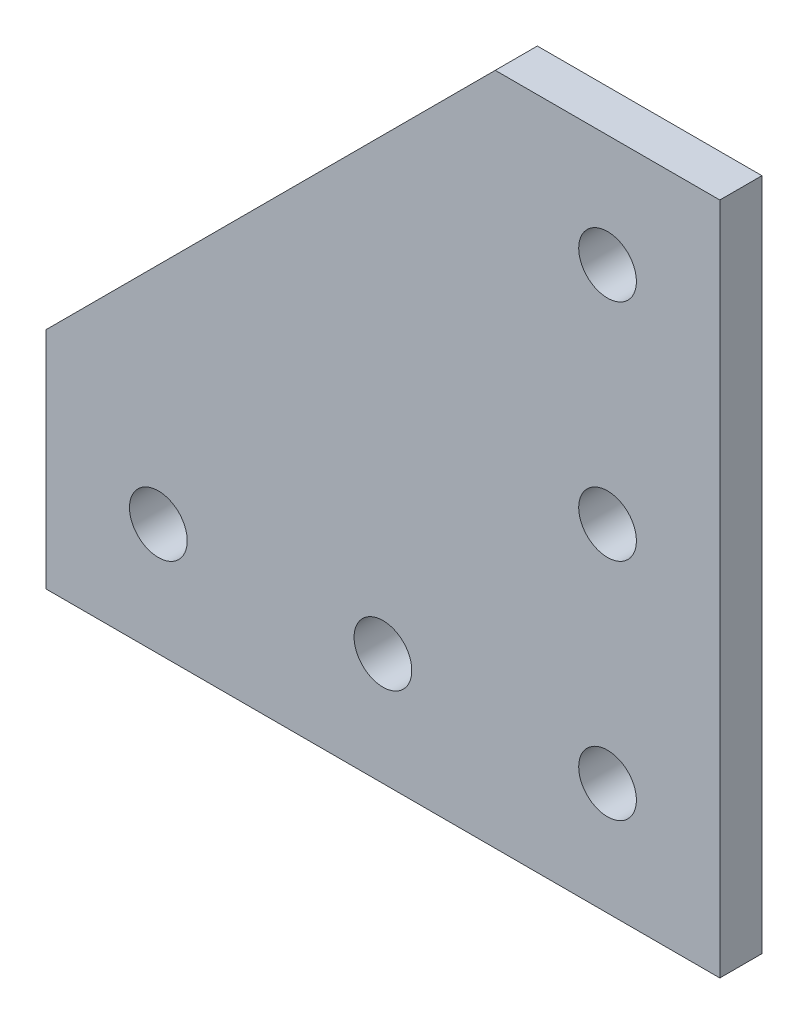
ISO-10303-21;
HEADER;
FILE_DESCRIPTION(('STEP AP214'),'2;1');
FILE_NAME('part.step','',(''),(''),'','','');
FILE_SCHEMA(('AUTOMOTIVE_DESIGN { 1 0 10303 214 1 1 1 1 }'));
ENDSEC;
DATA;
#1=APPLICATION_CONTEXT('core data for automotive mechanical design processes');
#2=APPLICATION_PROTOCOL_DEFINITION('international standard','automotive_design',2000,#1);
#3=PRODUCT_CONTEXT('',#1,'mechanical');
#4=PRODUCT('Part','Part','',(#3));
#5=PRODUCT_RELATED_PRODUCT_CATEGORY('part','',(#4));
#6=PRODUCT_DEFINITION_FORMATION('','',#4);
#7=PRODUCT_DEFINITION_CONTEXT('part definition',#1,'design');
#8=PRODUCT_DEFINITION('design','',#6,#7);
#9=PRODUCT_DEFINITION_SHAPE('','',#8);
#10=(LENGTH_UNIT() NAMED_UNIT(*) SI_UNIT(.MILLI.,.METRE.));
#11=(NAMED_UNIT(*) PLANE_ANGLE_UNIT() SI_UNIT($,.RADIAN.));
#12=(NAMED_UNIT(*) SI_UNIT($,.STERADIAN.) SOLID_ANGLE_UNIT());
#13=UNCERTAINTY_MEASURE_WITH_UNIT(LENGTH_MEASURE(1.E-05),#10,'distance_accuracy_value','');
#14=(GEOMETRIC_REPRESENTATION_CONTEXT(3) GLOBAL_UNCERTAINTY_ASSIGNED_CONTEXT((#13)) GLOBAL_UNIT_ASSIGNED_CONTEXT((#10,
#11,#12)) REPRESENTATION_CONTEXT('',''));
#15=CARTESIAN_POINT('',(0.,0.,0.));
#16=DIRECTION('',(0.,0.,1.));
#17=DIRECTION('',(1.,0.,0.));
#18=AXIS2_PLACEMENT_3D('',#15,#16,#17);
#19=CARTESIAN_POINT('',(-25.4,-25.4,-4.7625));
#20=DIRECTION('',(-0.707106781186548,0.707106781186547,0.));
#21=DIRECTION('',(-0.707106781186547,-0.707106781186548,0.));
#22=AXIS2_PLACEMENT_3D('',#19,#20,#21);
#23=PLANE('',#22);
#24=DIRECTION('',(-0.707106781186547,-0.707106781186548,0.));
#25=VECTOR('',#24,1.);
#26=CARTESIAN_POINT('',(-25.4,-25.4,0.));
#27=LINE('',#26,#25);
#28=CARTESIAN_POINT('',(25.4,25.4,0.));
#29=VERTEX_POINT('',#28);
#30=CARTESIAN_POINT('',(-25.4,-25.4,0.));
#31=VERTEX_POINT('',#30);
#32=EDGE_CURVE('E109',#29,#31,#27,.T.);
#33=ORIENTED_EDGE('',*,*,#32,.F.);
#34=DIRECTION('',(0.,0.,1.));
#35=VECTOR('',#34,1.);
#36=CARTESIAN_POINT('',(25.4,25.4,-4.7625));
#37=LINE('',#36,#35);
#38=CARTESIAN_POINT('',(25.4,25.4,-4.7625));
#39=VERTEX_POINT('',#38);
#40=EDGE_CURVE('E11',#39,#29,#37,.T.);
#41=ORIENTED_EDGE('',*,*,#40,.F.);
#42=DIRECTION('',(-0.707106781186547,-0.707106781186548,0.));
#43=VECTOR('',#42,1.);
#44=CARTESIAN_POINT('',(-25.4,-25.4,-4.7625));
#45=LINE('',#44,#43);
#46=CARTESIAN_POINT('',(-25.4,-25.4,-4.7625));
#47=VERTEX_POINT('',#46);
#48=EDGE_CURVE('E104',#39,#47,#45,.T.);
#49=ORIENTED_EDGE('',*,*,#48,.T.);
#50=DIRECTION('',(0.,0.,1.));
#51=VECTOR('',#50,1.);
#52=CARTESIAN_POINT('',(-25.4,-25.4,-4.7625));
#53=LINE('',#52,#51);
#54=EDGE_CURVE('E35',#47,#31,#53,.T.);
#55=ORIENTED_EDGE('',*,*,#54,.T.);
#56=EDGE_LOOP('',(#33,#41,#49,#55));
#57=FACE_BOUND('',#56,.T.);
#58=ADVANCED_FACE('F32',(#57),#23,.T.);
#59=CARTESIAN_POINT('',(25.4,25.4,-4.7625));
#60=DIRECTION('',(0.,1.,0.));
#61=DIRECTION('',(0.,0.,1.));
#62=AXIS2_PLACEMENT_3D('',#59,#60,#61);
#63=PLANE('',#62);
#64=DIRECTION('',(-1.,0.,0.));
#65=VECTOR('',#64,1.);
#66=CARTESIAN_POINT('',(25.4,25.4,0.));
#67=LINE('',#66,#65);
#68=CARTESIAN_POINT('',(50.8,25.4,0.));
#69=VERTEX_POINT('',#68);
#70=EDGE_CURVE('E119',#69,#29,#67,.T.);
#71=ORIENTED_EDGE('',*,*,#70,.F.);
#72=DIRECTION('',(0.,0.,1.));
#73=VECTOR('',#72,1.);
#74=CARTESIAN_POINT('',(50.8,25.4,-4.7625));
#75=LINE('',#74,#73);
#76=CARTESIAN_POINT('',(50.8,25.4,-4.7625));
#77=VERTEX_POINT('',#76);
#78=EDGE_CURVE('E41',#77,#69,#75,.T.);
#79=ORIENTED_EDGE('',*,*,#78,.F.);
#80=DIRECTION('',(-1.,0.,0.));
#81=VECTOR('',#80,1.);
#82=CARTESIAN_POINT('',(25.4,25.4,-4.7625));
#83=LINE('',#82,#81);
#84=EDGE_CURVE('E99',#77,#39,#83,.T.);
#85=ORIENTED_EDGE('',*,*,#84,.T.);
#86=ORIENTED_EDGE('',*,*,#40,.T.);
#87=EDGE_LOOP('',(#71,#79,#85,#86));
#88=FACE_BOUND('',#87,.T.);
#89=ADVANCED_FACE('F125',(#88),#63,.T.);
#90=CARTESIAN_POINT('',(50.8,25.4,-4.7625));
#91=DIRECTION('',(1.,0.,0.));
#92=DIRECTION('',(0.,1.,0.));
#93=AXIS2_PLACEMENT_3D('',#90,#91,#92);
#94=PLANE('',#93);
#95=DIRECTION('',(0.,1.,0.));
#96=VECTOR('',#95,1.);
#97=CARTESIAN_POINT('',(50.8,25.4,0.));
#98=LINE('',#97,#96);
#99=CARTESIAN_POINT('',(50.8,-50.8,0.));
#100=VERTEX_POINT('',#99);
#101=EDGE_CURVE('E88',#100,#69,#98,.T.);
#102=ORIENTED_EDGE('',*,*,#101,.F.);
#103=DIRECTION('',(0.,0.,1.));
#104=VECTOR('',#103,1.);
#105=CARTESIAN_POINT('',(50.8,-50.8,-4.7625));
#106=LINE('',#105,#104);
#107=CARTESIAN_POINT('',(50.8,-50.8,-4.7625));
#108=VERTEX_POINT('',#107);
#109=EDGE_CURVE('E83',#108,#100,#106,.T.);
#110=ORIENTED_EDGE('',*,*,#109,.F.);
#111=DIRECTION('',(0.,1.,0.));
#112=VECTOR('',#111,1.);
#113=CARTESIAN_POINT('',(50.8,25.4,-4.7625));
#114=LINE('',#113,#112);
#115=EDGE_CURVE('E86',#108,#77,#114,.T.);
#116=ORIENTED_EDGE('',*,*,#115,.T.);
#117=ORIENTED_EDGE('',*,*,#78,.T.);
#118=EDGE_LOOP('',(#102,#110,#116,#117));
#119=FACE_BOUND('',#118,.T.);
#120=ADVANCED_FACE('F85',(#119),#94,.T.);
#121=CARTESIAN_POINT('',(50.8,-50.8,-4.7625));
#122=DIRECTION('',(0.,-1.,0.));
#123=DIRECTION('',(1.,0.,0.));
#124=AXIS2_PLACEMENT_3D('',#121,#122,#123);
#125=PLANE('',#124);
#126=DIRECTION('',(1.,0.,0.));
#127=VECTOR('',#126,1.);
#128=CARTESIAN_POINT('',(50.8,-50.8,0.));
#129=LINE('',#128,#127);
#130=CARTESIAN_POINT('',(-25.4,-50.8,0.));
#131=VERTEX_POINT('',#130);
#132=EDGE_CURVE('E116',#131,#100,#129,.T.);
#133=ORIENTED_EDGE('',*,*,#132,.F.);
#134=DIRECTION('',(0.,0.,1.));
#135=VECTOR('',#134,1.);
#136=CARTESIAN_POINT('',(-25.4,-50.8,-4.7625));
#137=LINE('',#136,#135);
#138=CARTESIAN_POINT('',(-25.4,-50.8,-4.7625));
#139=VERTEX_POINT('',#138);
#140=EDGE_CURVE('E93',#139,#131,#137,.T.);
#141=ORIENTED_EDGE('',*,*,#140,.F.);
#142=DIRECTION('',(1.,0.,0.));
#143=VECTOR('',#142,1.);
#144=CARTESIAN_POINT('',(50.8,-50.8,-4.7625));
#145=LINE('',#144,#143);
#146=EDGE_CURVE('E98',#139,#108,#145,.T.);
#147=ORIENTED_EDGE('',*,*,#146,.T.);
#148=ORIENTED_EDGE('',*,*,#109,.T.);
#149=EDGE_LOOP('',(#133,#141,#147,#148));
#150=FACE_BOUND('',#149,.T.);
#151=ADVANCED_FACE('F101',(#150),#125,.T.);
#152=CARTESIAN_POINT('',(-25.4,-50.8,-4.7625));
#153=DIRECTION('',(-1.,0.,0.));
#154=DIRECTION('',(0.,0.,1.));
#155=AXIS2_PLACEMENT_3D('',#152,#153,#154);
#156=PLANE('',#155);
#157=DIRECTION('',(0.,-1.,0.));
#158=VECTOR('',#157,1.);
#159=CARTESIAN_POINT('',(-25.4,-50.8,0.));
#160=LINE('',#159,#158);
#161=EDGE_CURVE('E112',#31,#131,#160,.T.);
#162=ORIENTED_EDGE('',*,*,#161,.F.);
#163=ORIENTED_EDGE('',*,*,#54,.F.);
#164=DIRECTION('',(0.,-1.,0.));
#165=VECTOR('',#164,1.);
#166=CARTESIAN_POINT('',(-25.4,-50.8,-4.7625));
#167=LINE('',#166,#165);
#168=EDGE_CURVE('E102',#47,#139,#167,.T.);
#169=ORIENTED_EDGE('',*,*,#168,.T.);
#170=ORIENTED_EDGE('',*,*,#140,.T.);
#171=EDGE_LOOP('',(#162,#163,#169,#170));
#172=FACE_BOUND('',#171,.T.);
#173=ADVANCED_FACE('F122',(#172),#156,.T.);
#174=CARTESIAN_POINT('',(25.4,25.4,-4.7625));
#175=DIRECTION('',(0.,0.,-1.));
#176=DIRECTION('',(-1.,0.,0.));
#177=AXIS2_PLACEMENT_3D('',#174,#175,#176);
#178=PLANE('',#177);
#179=CARTESIAN_POINT('',(38.1,12.7,-4.7625));
#180=DIRECTION('',(0.,0.,-1.));
#181=DIRECTION('',(-1.,0.,0.));
#182=AXIS2_PLACEMENT_3D('',#179,#180,#181);
#183=CIRCLE('',#182,3.2639);
#184=CARTESIAN_POINT('',(34.8361,12.7,-4.7625));
#185=VERTEX_POINT('',#184);
#186=EDGE_CURVE('E175',#185,#185,#183,.T.);
#187=ORIENTED_EDGE('',*,*,#186,.F.);
#188=EDGE_LOOP('',(#187));
#189=FACE_BOUND('',#188,.T.);
#190=CARTESIAN_POINT('',(38.1,-12.7,-4.7625));
#191=DIRECTION('',(0.,0.,-1.));
#192=DIRECTION('',(-1.,0.,0.));
#193=AXIS2_PLACEMENT_3D('',#190,#191,#192);
#194=CIRCLE('',#193,3.2639);
#195=CARTESIAN_POINT('',(34.8361,-12.7,-4.7625));
#196=VERTEX_POINT('',#195);
#197=EDGE_CURVE('E177',#196,#196,#194,.T.);
#198=ORIENTED_EDGE('',*,*,#197,.F.);
#199=EDGE_LOOP('',(#198));
#200=FACE_BOUND('',#199,.T.);
#201=CARTESIAN_POINT('',(-12.7,-38.1,-4.7625));
#202=DIRECTION('',(0.,0.,-1.));
#203=DIRECTION('',(-1.,0.,0.));
#204=AXIS2_PLACEMENT_3D('',#201,#202,#203);
#205=CIRCLE('',#204,3.2639);
#206=CARTESIAN_POINT('',(-15.9639,-38.1,-4.7625));
#207=VERTEX_POINT('',#206);
#208=EDGE_CURVE('E183',#207,#207,#205,.T.);
#209=ORIENTED_EDGE('',*,*,#208,.F.);
#210=EDGE_LOOP('',(#209));
#211=FACE_BOUND('',#210,.T.);
#212=CARTESIAN_POINT('',(12.7,-38.1,-4.7625));
#213=DIRECTION('',(0.,0.,-1.));
#214=DIRECTION('',(-1.,0.,0.));
#215=AXIS2_PLACEMENT_3D('',#212,#213,#214);
#216=CIRCLE('',#215,3.2639);
#217=CARTESIAN_POINT('',(9.43609999999995,-38.1,-4.7625));
#218=VERTEX_POINT('',#217);
#219=EDGE_CURVE('E189',#218,#218,#216,.T.);
#220=ORIENTED_EDGE('',*,*,#219,.F.);
#221=EDGE_LOOP('',(#220));
#222=FACE_BOUND('',#221,.T.);
#223=CARTESIAN_POINT('',(38.1,-38.1,-4.7625));
#224=DIRECTION('',(0.,0.,-1.));
#225=DIRECTION('',(-1.,0.,0.));
#226=AXIS2_PLACEMENT_3D('',#223,#224,#225);
#227=CIRCLE('',#226,3.2639);
#228=CARTESIAN_POINT('',(34.8361,-38.1,-4.7625));
#229=VERTEX_POINT('',#228);
#230=EDGE_CURVE('E195',#229,#229,#227,.T.);
#231=ORIENTED_EDGE('',*,*,#230,.F.);
#232=EDGE_LOOP('',(#231));
#233=FACE_BOUND('',#232,.T.);
#234=ORIENTED_EDGE('',*,*,#48,.F.);
#235=ORIENTED_EDGE('',*,*,#84,.F.);
#236=ORIENTED_EDGE('',*,*,#115,.F.);
#237=ORIENTED_EDGE('',*,*,#146,.F.);
#238=ORIENTED_EDGE('',*,*,#168,.F.);
#239=EDGE_LOOP('',(#234,#235,#236,#237,#238));
#240=FACE_BOUND('',#239,.T.);
#241=ADVANCED_FACE('F97',(#189,#200,#211,#222,#233,#240),#178,.T.);
#242=CARTESIAN_POINT('',(25.4,25.4,0.));
#243=DIRECTION('',(0.,0.,-1.));
#244=DIRECTION('',(-1.,0.,0.));
#245=AXIS2_PLACEMENT_3D('',#242,#243,#244);
#246=PLANE('',#245);
#247=CARTESIAN_POINT('',(38.1,12.7,0.));
#248=DIRECTION('',(0.,0.,-1.));
#249=DIRECTION('',(-1.,0.,0.));
#250=AXIS2_PLACEMENT_3D('',#247,#248,#249);
#251=CIRCLE('',#250,3.2639);
#252=CARTESIAN_POINT('',(34.8361,12.7,0.));
#253=VERTEX_POINT('',#252);
#254=EDGE_CURVE('E173',#253,#253,#251,.T.);
#255=ORIENTED_EDGE('',*,*,#254,.T.);
#256=EDGE_LOOP('',(#255));
#257=FACE_BOUND('',#256,.T.);
#258=CARTESIAN_POINT('',(38.1,-12.7,0.));
#259=DIRECTION('',(0.,0.,-1.));
#260=DIRECTION('',(-1.,0.,0.));
#261=AXIS2_PLACEMENT_3D('',#258,#259,#260);
#262=CIRCLE('',#261,3.2639);
#263=CARTESIAN_POINT('',(34.8361,-12.7,0.));
#264=VERTEX_POINT('',#263);
#265=EDGE_CURVE('E180',#264,#264,#262,.T.);
#266=ORIENTED_EDGE('',*,*,#265,.T.);
#267=EDGE_LOOP('',(#266));
#268=FACE_BOUND('',#267,.T.);
#269=CARTESIAN_POINT('',(-12.7,-38.1,0.));
#270=DIRECTION('',(0.,0.,-1.));
#271=DIRECTION('',(-1.,0.,0.));
#272=AXIS2_PLACEMENT_3D('',#269,#270,#271);
#273=CIRCLE('',#272,3.2639);
#274=CARTESIAN_POINT('',(-15.9639,-38.1,0.));
#275=VERTEX_POINT('',#274);
#276=EDGE_CURVE('E186',#275,#275,#273,.T.);
#277=ORIENTED_EDGE('',*,*,#276,.T.);
#278=EDGE_LOOP('',(#277));
#279=FACE_BOUND('',#278,.T.);
#280=CARTESIAN_POINT('',(12.7,-38.1,0.));
#281=DIRECTION('',(0.,0.,-1.));
#282=DIRECTION('',(-1.,0.,0.));
#283=AXIS2_PLACEMENT_3D('',#280,#281,#282);
#284=CIRCLE('',#283,3.2639);
#285=CARTESIAN_POINT('',(9.43609999999995,-38.1,0.));
#286=VERTEX_POINT('',#285);
#287=EDGE_CURVE('E192',#286,#286,#284,.T.);
#288=ORIENTED_EDGE('',*,*,#287,.T.);
#289=EDGE_LOOP('',(#288));
#290=FACE_BOUND('',#289,.T.);
#291=CARTESIAN_POINT('',(38.1,-38.1,0.));
#292=DIRECTION('',(0.,0.,-1.));
#293=DIRECTION('',(-1.,0.,0.));
#294=AXIS2_PLACEMENT_3D('',#291,#292,#293);
#295=CIRCLE('',#294,3.2639);
#296=CARTESIAN_POINT('',(34.8361,-38.1,0.));
#297=VERTEX_POINT('',#296);
#298=EDGE_CURVE('E113',#297,#297,#295,.T.);
#299=ORIENTED_EDGE('',*,*,#298,.T.);
#300=EDGE_LOOP('',(#299));
#301=FACE_BOUND('',#300,.T.);
#302=ORIENTED_EDGE('',*,*,#32,.T.);
#303=ORIENTED_EDGE('',*,*,#161,.T.);
#304=ORIENTED_EDGE('',*,*,#132,.T.);
#305=ORIENTED_EDGE('',*,*,#101,.T.);
#306=ORIENTED_EDGE('',*,*,#70,.T.);
#307=EDGE_LOOP('',(#302,#303,#304,#305,#306));
#308=FACE_BOUND('',#307,.T.);
#309=ADVANCED_FACE('F124',(#257,#268,#279,#290,#301,#308),#246,.F.);
#310=CARTESIAN_POINT('',(38.1,-38.1,0.));
#311=DIRECTION('',(0.,0.,-1.));
#312=DIRECTION('',(-1.,0.,0.));
#313=AXIS2_PLACEMENT_3D('',#310,#311,#312);
#314=CYLINDRICAL_SURFACE('',#313,3.2639);
#315=CARTESIAN_POINT('',(34.8361,-38.1,0.));
#316=CARTESIAN_POINT('',(34.8361,-38.1,-0.049609375));
#317=CARTESIAN_POINT('',(34.8361,-38.1,-0.09921875));
#318=CARTESIAN_POINT('',(34.8361,-38.1,-0.1984375));
#319=CARTESIAN_POINT('',(34.8361,-38.1,-0.248046875));
#320=CARTESIAN_POINT('',(34.8361,-38.1,-0.347265625));
#321=CARTESIAN_POINT('',(34.8361,-38.1,-0.396875));
#322=CARTESIAN_POINT('',(34.8361,-38.1,-0.49609375));
#323=CARTESIAN_POINT('',(34.8361,-38.1,-0.545703125));
#324=CARTESIAN_POINT('',(34.8361,-38.1,-0.644921875));
#325=CARTESIAN_POINT('',(34.8361,-38.1,-0.69453125));
#326=CARTESIAN_POINT('',(34.8361,-38.1,-0.79375));
#327=CARTESIAN_POINT('',(34.8361,-38.1,-0.843359375));
#328=CARTESIAN_POINT('',(34.8361,-38.1,-0.942578125));
#329=CARTESIAN_POINT('',(34.8361,-38.1,-0.9921875));
#330=CARTESIAN_POINT('',(34.8361,-38.1,-1.09140625));
#331=CARTESIAN_POINT('',(34.8361,-38.1,-1.141015625));
#332=CARTESIAN_POINT('',(34.8361,-38.1,-1.240234375));
#333=CARTESIAN_POINT('',(34.8361,-38.1,-1.28984375));
#334=CARTESIAN_POINT('',(34.8361,-38.1,-1.3890625));
#335=CARTESIAN_POINT('',(34.8361,-38.1,-1.438671875));
#336=CARTESIAN_POINT('',(34.8361,-38.1,-1.537890625));
#337=CARTESIAN_POINT('',(34.8361,-38.1,-1.5875));
#338=CARTESIAN_POINT('',(34.8361,-38.1,-1.68671875));
#339=CARTESIAN_POINT('',(34.8361,-38.1,-1.736328125));
#340=CARTESIAN_POINT('',(34.8361,-38.1,-1.835546875));
#341=CARTESIAN_POINT('',(34.8361,-38.1,-1.88515625));
#342=CARTESIAN_POINT('',(34.8361,-38.1,-1.984375));
#343=CARTESIAN_POINT('',(34.8361,-38.1,-2.033984375));
#344=CARTESIAN_POINT('',(34.8361,-38.1,-2.133203125));
#345=CARTESIAN_POINT('',(34.8361,-38.1,-2.1828125));
#346=CARTESIAN_POINT('',(34.8361,-38.1,-2.28203125));
#347=CARTESIAN_POINT('',(34.8361,-38.1,-2.331640625));
#348=CARTESIAN_POINT('',(34.8361,-38.1,-2.430859375));
#349=CARTESIAN_POINT('',(34.8361,-38.1,-2.48046875));
#350=CARTESIAN_POINT('',(34.8361,-38.1,-2.5796875));
#351=CARTESIAN_POINT('',(34.8361,-38.1,-2.629296875));
#352=CARTESIAN_POINT('',(34.8361,-38.1,-2.728515625));
#353=CARTESIAN_POINT('',(34.8361,-38.1,-2.778125));
#354=CARTESIAN_POINT('',(34.8361,-38.1,-2.87734375));
#355=CARTESIAN_POINT('',(34.8361,-38.1,-2.926953125));
#356=CARTESIAN_POINT('',(34.8361,-38.1,-3.026171875));
#357=CARTESIAN_POINT('',(34.8361,-38.1,-3.07578125));
#358=CARTESIAN_POINT('',(34.8361,-38.1,-3.175));
#359=CARTESIAN_POINT('',(34.8361,-38.1,-3.224609375));
#360=CARTESIAN_POINT('',(34.8361,-38.1,-3.323828125));
#361=CARTESIAN_POINT('',(34.8361,-38.1,-3.3734375));
#362=CARTESIAN_POINT('',(34.8361,-38.1,-3.47265625));
#363=CARTESIAN_POINT('',(34.8361,-38.1,-3.522265625));
#364=CARTESIAN_POINT('',(34.8361,-38.1,-3.621484375));
#365=CARTESIAN_POINT('',(34.8361,-38.1,-3.67109375));
#366=CARTESIAN_POINT('',(34.8361,-38.1,-3.7703125));
#367=CARTESIAN_POINT('',(34.8361,-38.1,-3.819921875));
#368=CARTESIAN_POINT('',(34.8361,-38.1,-3.919140625));
#369=CARTESIAN_POINT('',(34.8361,-38.1,-3.96875));
#370=CARTESIAN_POINT('',(34.8361,-38.1,-4.06796875));
#371=CARTESIAN_POINT('',(34.8361,-38.1,-4.117578125));
#372=CARTESIAN_POINT('',(34.8361,-38.1,-4.216796875));
#373=CARTESIAN_POINT('',(34.8361,-38.1,-4.26640625));
#374=CARTESIAN_POINT('',(34.8361,-38.1,-4.365625));
#375=CARTESIAN_POINT('',(34.8361,-38.1,-4.415234375));
#376=CARTESIAN_POINT('',(34.8361,-38.1,-4.514453125));
#377=CARTESIAN_POINT('',(34.8361,-38.1,-4.5640625));
#378=CARTESIAN_POINT('',(34.8361,-38.1,-4.66328125));
#379=CARTESIAN_POINT('',(34.8361,-38.1,-4.712890625));
#380=CARTESIAN_POINT('',(34.8361,-38.1,-4.7625));
#381=B_SPLINE_CURVE_WITH_KNOTS('',3,(#315,#316,#317,#318,#319,#320,#321,#322,#323,#324,#325,
#326,#327,#328,#329,#330,#331,#332,#333,#334,#335,#336,#337,#338,#339,#340,#341,#342,#343,#344,
#345,#346,#347,#348,#349,#350,#351,#352,#353,#354,#355,#356,#357,#358,#359,#360,#361,#362,#363,
#364,#365,#366,#367,#368,#369,#370,#371,#372,#373,#374,#375,#376,#377,#378,#379,#380),
.UNSPECIFIED.,.F.,.F.,(4,2,2,2,2,2,2,2,2,2,2,2,2,2,2,2,2,2,2,2,2,2,2,2,2,2,2,2,2,2,2,2,4),(0.,
0.148828125,0.29765625,0.446484375,0.5953125,0.744140625,0.89296875,1.041796875,1.190625,
1.339453125,1.48828125,1.637109375,1.7859375,1.934765625,2.08359375,2.232421875,2.38125,
2.530078125,2.67890625,2.827734375,2.9765625,3.125390625,3.27421875,3.423046875,3.571875,
3.720703125,3.86953125,4.018359375,4.1671875,4.316015625,4.46484375,4.613671875,4.7625),.UNSPECIFIED.);
#382=EDGE_CURVE('BSEAM145',#297,#229,#381,.T.);
#383=ORIENTED_EDGE('',*,*,#298,.F.);
#384=ORIENTED_EDGE('',*,*,#230,.T.);
#385=ORIENTED_EDGE('',*,*,#382,.T.);
#386=ORIENTED_EDGE('',*,*,#382,.F.);
#387=EDGE_LOOP('',(#383,#385,#384,#386));
#388=FACE_BOUND('',#387,.T.);
#389=ADVANCED_FACE('F145',(#388),#314,.F.);
#390=CARTESIAN_POINT('',(12.7,-38.1,0.));
#391=DIRECTION('',(0.,0.,-1.));
#392=DIRECTION('',(-1.,0.,0.));
#393=AXIS2_PLACEMENT_3D('',#390,#391,#392);
#394=CYLINDRICAL_SURFACE('',#393,3.2639);
#395=CARTESIAN_POINT('',(9.43609999999995,-38.1,0.));
#396=CARTESIAN_POINT('',(9.43609999999995,-38.1,-0.049609375));
#397=CARTESIAN_POINT('',(9.43609999999995,-38.1,-0.09921875));
#398=CARTESIAN_POINT('',(9.43609999999995,-38.1,-0.1984375));
#399=CARTESIAN_POINT('',(9.43609999999995,-38.1,-0.248046875));
#400=CARTESIAN_POINT('',(9.43609999999995,-38.1,-0.347265625));
#401=CARTESIAN_POINT('',(9.43609999999995,-38.1,-0.396875));
#402=CARTESIAN_POINT('',(9.43609999999995,-38.1,-0.49609375));
#403=CARTESIAN_POINT('',(9.43609999999995,-38.1,-0.545703125));
#404=CARTESIAN_POINT('',(9.43609999999995,-38.1,-0.644921875));
#405=CARTESIAN_POINT('',(9.43609999999995,-38.1,-0.69453125));
#406=CARTESIAN_POINT('',(9.43609999999995,-38.1,-0.79375));
#407=CARTESIAN_POINT('',(9.43609999999995,-38.1,-0.843359375));
#408=CARTESIAN_POINT('',(9.43609999999995,-38.1,-0.942578125));
#409=CARTESIAN_POINT('',(9.43609999999995,-38.1,-0.9921875));
#410=CARTESIAN_POINT('',(9.43609999999995,-38.1,-1.09140625));
#411=CARTESIAN_POINT('',(9.43609999999995,-38.1,-1.141015625));
#412=CARTESIAN_POINT('',(9.43609999999995,-38.1,-1.240234375));
#413=CARTESIAN_POINT('',(9.43609999999995,-38.1,-1.28984375));
#414=CARTESIAN_POINT('',(9.43609999999995,-38.1,-1.3890625));
#415=CARTESIAN_POINT('',(9.43609999999995,-38.1,-1.438671875));
#416=CARTESIAN_POINT('',(9.43609999999995,-38.1,-1.537890625));
#417=CARTESIAN_POINT('',(9.43609999999995,-38.1,-1.5875));
#418=CARTESIAN_POINT('',(9.43609999999995,-38.1,-1.68671875));
#419=CARTESIAN_POINT('',(9.43609999999995,-38.1,-1.736328125));
#420=CARTESIAN_POINT('',(9.43609999999995,-38.1,-1.835546875));
#421=CARTESIAN_POINT('',(9.43609999999995,-38.1,-1.88515625));
#422=CARTESIAN_POINT('',(9.43609999999995,-38.1,-1.984375));
#423=CARTESIAN_POINT('',(9.43609999999995,-38.1,-2.033984375));
#424=CARTESIAN_POINT('',(9.43609999999995,-38.1,-2.133203125));
#425=CARTESIAN_POINT('',(9.43609999999995,-38.1,-2.1828125));
#426=CARTESIAN_POINT('',(9.43609999999995,-38.1,-2.28203125));
#427=CARTESIAN_POINT('',(9.43609999999995,-38.1,-2.331640625));
#428=CARTESIAN_POINT('',(9.43609999999995,-38.1,-2.430859375));
#429=CARTESIAN_POINT('',(9.43609999999995,-38.1,-2.48046875));
#430=CARTESIAN_POINT('',(9.43609999999995,-38.1,-2.5796875));
#431=CARTESIAN_POINT('',(9.43609999999995,-38.1,-2.629296875));
#432=CARTESIAN_POINT('',(9.43609999999995,-38.1,-2.728515625));
#433=CARTESIAN_POINT('',(9.43609999999995,-38.1,-2.778125));
#434=CARTESIAN_POINT('',(9.43609999999995,-38.1,-2.87734375));
#435=CARTESIAN_POINT('',(9.43609999999995,-38.1,-2.926953125));
#436=CARTESIAN_POINT('',(9.43609999999995,-38.1,-3.026171875));
#437=CARTESIAN_POINT('',(9.43609999999995,-38.1,-3.07578125));
#438=CARTESIAN_POINT('',(9.43609999999995,-38.1,-3.175));
#439=CARTESIAN_POINT('',(9.43609999999995,-38.1,-3.224609375));
#440=CARTESIAN_POINT('',(9.43609999999995,-38.1,-3.323828125));
#441=CARTESIAN_POINT('',(9.43609999999995,-38.1,-3.3734375));
#442=CARTESIAN_POINT('',(9.43609999999995,-38.1,-3.47265625));
#443=CARTESIAN_POINT('',(9.43609999999995,-38.1,-3.522265625));
#444=CARTESIAN_POINT('',(9.43609999999995,-38.1,-3.621484375));
#445=CARTESIAN_POINT('',(9.43609999999995,-38.1,-3.67109375));
#446=CARTESIAN_POINT('',(9.43609999999995,-38.1,-3.7703125));
#447=CARTESIAN_POINT('',(9.43609999999995,-38.1,-3.819921875));
#448=CARTESIAN_POINT('',(9.43609999999995,-38.1,-3.919140625));
#449=CARTESIAN_POINT('',(9.43609999999995,-38.1,-3.96875));
#450=CARTESIAN_POINT('',(9.43609999999995,-38.1,-4.06796875));
#451=CARTESIAN_POINT('',(9.43609999999995,-38.1,-4.117578125));
#452=CARTESIAN_POINT('',(9.43609999999995,-38.1,-4.216796875));
#453=CARTESIAN_POINT('',(9.43609999999995,-38.1,-4.26640625));
#454=CARTESIAN_POINT('',(9.43609999999995,-38.1,-4.365625));
#455=CARTESIAN_POINT('',(9.43609999999995,-38.1,-4.415234375));
#456=CARTESIAN_POINT('',(9.43609999999995,-38.1,-4.514453125));
#457=CARTESIAN_POINT('',(9.43609999999995,-38.1,-4.5640625));
#458=CARTESIAN_POINT('',(9.43609999999995,-38.1,-4.66328125));
#459=CARTESIAN_POINT('',(9.43609999999995,-38.1,-4.712890625));
#460=CARTESIAN_POINT('',(9.43609999999995,-38.1,-4.7625));
#461=B_SPLINE_CURVE_WITH_KNOTS('',3,(#395,#396,#397,#398,#399,#400,#401,#402,#403,#404,#405,
#406,#407,#408,#409,#410,#411,#412,#413,#414,#415,#416,#417,#418,#419,#420,#421,#422,#423,#424,
#425,#426,#427,#428,#429,#430,#431,#432,#433,#434,#435,#436,#437,#438,#439,#440,#441,#442,#443,
#444,#445,#446,#447,#448,#449,#450,#451,#452,#453,#454,#455,#456,#457,#458,#459,#460),
.UNSPECIFIED.,.F.,.F.,(4,2,2,2,2,2,2,2,2,2,2,2,2,2,2,2,2,2,2,2,2,2,2,2,2,2,2,2,2,2,2,2,4),(0.,
0.148828125,0.29765625,0.446484375,0.5953125,0.744140625,0.89296875,1.041796875,1.190625,
1.339453125,1.48828125,1.637109375,1.7859375,1.934765625,2.08359375,2.232421875,2.38125,
2.530078125,2.67890625,2.827734375,2.9765625,3.125390625,3.27421875,3.423046875,3.571875,
3.720703125,3.86953125,4.018359375,4.1671875,4.316015625,4.46484375,4.613671875,4.7625),.UNSPECIFIED.);
#462=EDGE_CURVE('BSEAM152',#286,#218,#461,.T.);
#463=ORIENTED_EDGE('',*,*,#287,.F.);
#464=ORIENTED_EDGE('',*,*,#219,.T.);
#465=ORIENTED_EDGE('',*,*,#462,.T.);
#466=ORIENTED_EDGE('',*,*,#462,.F.);
#467=EDGE_LOOP('',(#463,#465,#464,#466));
#468=FACE_BOUND('',#467,.T.);
#469=ADVANCED_FACE('F152',(#468),#394,.F.);
#470=CARTESIAN_POINT('',(-12.7,-38.1,0.));
#471=DIRECTION('',(0.,0.,-1.));
#472=DIRECTION('',(-1.,0.,0.));
#473=AXIS2_PLACEMENT_3D('',#470,#471,#472);
#474=CYLINDRICAL_SURFACE('',#473,3.2639);
#475=CARTESIAN_POINT('',(-15.9639,-38.1,0.));
#476=CARTESIAN_POINT('',(-15.9639,-38.1,-0.049609375));
#477=CARTESIAN_POINT('',(-15.9639,-38.1,-0.09921875));
#478=CARTESIAN_POINT('',(-15.9639,-38.1,-0.1984375));
#479=CARTESIAN_POINT('',(-15.9639,-38.1,-0.248046875));
#480=CARTESIAN_POINT('',(-15.9639,-38.1,-0.347265625));
#481=CARTESIAN_POINT('',(-15.9639,-38.1,-0.396875));
#482=CARTESIAN_POINT('',(-15.9639,-38.1,-0.49609375));
#483=CARTESIAN_POINT('',(-15.9639,-38.1,-0.545703125));
#484=CARTESIAN_POINT('',(-15.9639,-38.1,-0.644921875));
#485=CARTESIAN_POINT('',(-15.9639,-38.1,-0.69453125));
#486=CARTESIAN_POINT('',(-15.9639,-38.1,-0.79375));
#487=CARTESIAN_POINT('',(-15.9639,-38.1,-0.843359375));
#488=CARTESIAN_POINT('',(-15.9639,-38.1,-0.942578125));
#489=CARTESIAN_POINT('',(-15.9639,-38.1,-0.9921875));
#490=CARTESIAN_POINT('',(-15.9639,-38.1,-1.09140625));
#491=CARTESIAN_POINT('',(-15.9639,-38.1,-1.141015625));
#492=CARTESIAN_POINT('',(-15.9639,-38.1,-1.240234375));
#493=CARTESIAN_POINT('',(-15.9639,-38.1,-1.28984375));
#494=CARTESIAN_POINT('',(-15.9639,-38.1,-1.3890625));
#495=CARTESIAN_POINT('',(-15.9639,-38.1,-1.438671875));
#496=CARTESIAN_POINT('',(-15.9639,-38.1,-1.537890625));
#497=CARTESIAN_POINT('',(-15.9639,-38.1,-1.5875));
#498=CARTESIAN_POINT('',(-15.9639,-38.1,-1.68671875));
#499=CARTESIAN_POINT('',(-15.9639,-38.1,-1.736328125));
#500=CARTESIAN_POINT('',(-15.9639,-38.1,-1.835546875));
#501=CARTESIAN_POINT('',(-15.9639,-38.1,-1.88515625));
#502=CARTESIAN_POINT('',(-15.9639,-38.1,-1.984375));
#503=CARTESIAN_POINT('',(-15.9639,-38.1,-2.033984375));
#504=CARTESIAN_POINT('',(-15.9639,-38.1,-2.133203125));
#505=CARTESIAN_POINT('',(-15.9639,-38.1,-2.1828125));
#506=CARTESIAN_POINT('',(-15.9639,-38.1,-2.28203125));
#507=CARTESIAN_POINT('',(-15.9639,-38.1,-2.331640625));
#508=CARTESIAN_POINT('',(-15.9639,-38.1,-2.430859375));
#509=CARTESIAN_POINT('',(-15.9639,-38.1,-2.48046875));
#510=CARTESIAN_POINT('',(-15.9639,-38.1,-2.5796875));
#511=CARTESIAN_POINT('',(-15.9639,-38.1,-2.629296875));
#512=CARTESIAN_POINT('',(-15.9639,-38.1,-2.728515625));
#513=CARTESIAN_POINT('',(-15.9639,-38.1,-2.778125));
#514=CARTESIAN_POINT('',(-15.9639,-38.1,-2.87734375));
#515=CARTESIAN_POINT('',(-15.9639,-38.1,-2.926953125));
#516=CARTESIAN_POINT('',(-15.9639,-38.1,-3.026171875));
#517=CARTESIAN_POINT('',(-15.9639,-38.1,-3.07578125));
#518=CARTESIAN_POINT('',(-15.9639,-38.1,-3.175));
#519=CARTESIAN_POINT('',(-15.9639,-38.1,-3.224609375));
#520=CARTESIAN_POINT('',(-15.9639,-38.1,-3.323828125));
#521=CARTESIAN_POINT('',(-15.9639,-38.1,-3.3734375));
#522=CARTESIAN_POINT('',(-15.9639,-38.1,-3.47265625));
#523=CARTESIAN_POINT('',(-15.9639,-38.1,-3.522265625));
#524=CARTESIAN_POINT('',(-15.9639,-38.1,-3.621484375));
#525=CARTESIAN_POINT('',(-15.9639,-38.1,-3.67109375));
#526=CARTESIAN_POINT('',(-15.9639,-38.1,-3.7703125));
#527=CARTESIAN_POINT('',(-15.9639,-38.1,-3.819921875));
#528=CARTESIAN_POINT('',(-15.9639,-38.1,-3.919140625));
#529=CARTESIAN_POINT('',(-15.9639,-38.1,-3.96875));
#530=CARTESIAN_POINT('',(-15.9639,-38.1,-4.06796875));
#531=CARTESIAN_POINT('',(-15.9639,-38.1,-4.117578125));
#532=CARTESIAN_POINT('',(-15.9639,-38.1,-4.216796875));
#533=CARTESIAN_POINT('',(-15.9639,-38.1,-4.26640625));
#534=CARTESIAN_POINT('',(-15.9639,-38.1,-4.365625));
#535=CARTESIAN_POINT('',(-15.9639,-38.1,-4.415234375));
#536=CARTESIAN_POINT('',(-15.9639,-38.1,-4.514453125));
#537=CARTESIAN_POINT('',(-15.9639,-38.1,-4.5640625));
#538=CARTESIAN_POINT('',(-15.9639,-38.1,-4.66328125));
#539=CARTESIAN_POINT('',(-15.9639,-38.1,-4.712890625));
#540=CARTESIAN_POINT('',(-15.9639,-38.1,-4.7625));
#541=B_SPLINE_CURVE_WITH_KNOTS('',3,(#475,#476,#477,#478,#479,#480,#481,#482,#483,#484,#485,
#486,#487,#488,#489,#490,#491,#492,#493,#494,#495,#496,#497,#498,#499,#500,#501,#502,#503,#504,
#505,#506,#507,#508,#509,#510,#511,#512,#513,#514,#515,#516,#517,#518,#519,#520,#521,#522,#523,
#524,#525,#526,#527,#528,#529,#530,#531,#532,#533,#534,#535,#536,#537,#538,#539,#540),
.UNSPECIFIED.,.F.,.F.,(4,2,2,2,2,2,2,2,2,2,2,2,2,2,2,2,2,2,2,2,2,2,2,2,2,2,2,2,2,2,2,2,4),(0.,
0.148828125,0.29765625,0.446484375,0.5953125,0.744140625,0.89296875,1.041796875,1.190625,
1.339453125,1.48828125,1.637109375,1.7859375,1.934765625,2.08359375,2.232421875,2.38125,
2.530078125,2.67890625,2.827734375,2.9765625,3.125390625,3.27421875,3.423046875,3.571875,
3.720703125,3.86953125,4.018359375,4.1671875,4.316015625,4.46484375,4.613671875,4.7625),.UNSPECIFIED.);
#542=EDGE_CURVE('BSEAM156',#275,#207,#541,.T.);
#543=ORIENTED_EDGE('',*,*,#276,.F.);
#544=ORIENTED_EDGE('',*,*,#208,.T.);
#545=ORIENTED_EDGE('',*,*,#542,.T.);
#546=ORIENTED_EDGE('',*,*,#542,.F.);
#547=EDGE_LOOP('',(#543,#545,#544,#546));
#548=FACE_BOUND('',#547,.T.);
#549=ADVANCED_FACE('F156',(#548),#474,.F.);
#550=CARTESIAN_POINT('',(38.1,-12.7,0.));
#551=DIRECTION('',(0.,0.,-1.));
#552=DIRECTION('',(-1.,0.,0.));
#553=AXIS2_PLACEMENT_3D('',#550,#551,#552);
#554=CYLINDRICAL_SURFACE('',#553,3.2639);
#555=CARTESIAN_POINT('',(34.8361,-12.7,0.));
#556=CARTESIAN_POINT('',(34.8361,-12.7,-0.049609375));
#557=CARTESIAN_POINT('',(34.8361,-12.7,-0.09921875));
#558=CARTESIAN_POINT('',(34.8361,-12.7,-0.1984375));
#559=CARTESIAN_POINT('',(34.8361,-12.7,-0.248046875));
#560=CARTESIAN_POINT('',(34.8361,-12.7,-0.347265625));
#561=CARTESIAN_POINT('',(34.8361,-12.7,-0.396875));
#562=CARTESIAN_POINT('',(34.8361,-12.7,-0.49609375));
#563=CARTESIAN_POINT('',(34.8361,-12.7,-0.545703125));
#564=CARTESIAN_POINT('',(34.8361,-12.7,-0.644921875));
#565=CARTESIAN_POINT('',(34.8361,-12.7,-0.69453125));
#566=CARTESIAN_POINT('',(34.8361,-12.7,-0.79375));
#567=CARTESIAN_POINT('',(34.8361,-12.7,-0.843359375));
#568=CARTESIAN_POINT('',(34.8361,-12.7,-0.942578125));
#569=CARTESIAN_POINT('',(34.8361,-12.7,-0.9921875));
#570=CARTESIAN_POINT('',(34.8361,-12.7,-1.09140625));
#571=CARTESIAN_POINT('',(34.8361,-12.7,-1.141015625));
#572=CARTESIAN_POINT('',(34.8361,-12.7,-1.240234375));
#573=CARTESIAN_POINT('',(34.8361,-12.7,-1.28984375));
#574=CARTESIAN_POINT('',(34.8361,-12.7,-1.3890625));
#575=CARTESIAN_POINT('',(34.8361,-12.7,-1.438671875));
#576=CARTESIAN_POINT('',(34.8361,-12.7,-1.537890625));
#577=CARTESIAN_POINT('',(34.8361,-12.7,-1.5875));
#578=CARTESIAN_POINT('',(34.8361,-12.7,-1.68671875));
#579=CARTESIAN_POINT('',(34.8361,-12.7,-1.736328125));
#580=CARTESIAN_POINT('',(34.8361,-12.7,-1.835546875));
#581=CARTESIAN_POINT('',(34.8361,-12.7,-1.88515625));
#582=CARTESIAN_POINT('',(34.8361,-12.7,-1.984375));
#583=CARTESIAN_POINT('',(34.8361,-12.7,-2.033984375));
#584=CARTESIAN_POINT('',(34.8361,-12.7,-2.133203125));
#585=CARTESIAN_POINT('',(34.8361,-12.7,-2.1828125));
#586=CARTESIAN_POINT('',(34.8361,-12.7,-2.28203125));
#587=CARTESIAN_POINT('',(34.8361,-12.7,-2.331640625));
#588=CARTESIAN_POINT('',(34.8361,-12.7,-2.430859375));
#589=CARTESIAN_POINT('',(34.8361,-12.7,-2.48046875));
#590=CARTESIAN_POINT('',(34.8361,-12.7,-2.5796875));
#591=CARTESIAN_POINT('',(34.8361,-12.7,-2.629296875));
#592=CARTESIAN_POINT('',(34.8361,-12.7,-2.728515625));
#593=CARTESIAN_POINT('',(34.8361,-12.7,-2.778125));
#594=CARTESIAN_POINT('',(34.8361,-12.7,-2.87734375));
#595=CARTESIAN_POINT('',(34.8361,-12.7,-2.926953125));
#596=CARTESIAN_POINT('',(34.8361,-12.7,-3.026171875));
#597=CARTESIAN_POINT('',(34.8361,-12.7,-3.07578125));
#598=CARTESIAN_POINT('',(34.8361,-12.7,-3.175));
#599=CARTESIAN_POINT('',(34.8361,-12.7,-3.224609375));
#600=CARTESIAN_POINT('',(34.8361,-12.7,-3.323828125));
#601=CARTESIAN_POINT('',(34.8361,-12.7,-3.3734375));
#602=CARTESIAN_POINT('',(34.8361,-12.7,-3.47265625));
#603=CARTESIAN_POINT('',(34.8361,-12.7,-3.522265625));
#604=CARTESIAN_POINT('',(34.8361,-12.7,-3.621484375));
#605=CARTESIAN_POINT('',(34.8361,-12.7,-3.67109375));
#606=CARTESIAN_POINT('',(34.8361,-12.7,-3.7703125));
#607=CARTESIAN_POINT('',(34.8361,-12.7,-3.819921875));
#608=CARTESIAN_POINT('',(34.8361,-12.7,-3.919140625));
#609=CARTESIAN_POINT('',(34.8361,-12.7,-3.96875));
#610=CARTESIAN_POINT('',(34.8361,-12.7,-4.06796875));
#611=CARTESIAN_POINT('',(34.8361,-12.7,-4.117578125));
#612=CARTESIAN_POINT('',(34.8361,-12.7,-4.216796875));
#613=CARTESIAN_POINT('',(34.8361,-12.7,-4.26640625));
#614=CARTESIAN_POINT('',(34.8361,-12.7,-4.365625));
#615=CARTESIAN_POINT('',(34.8361,-12.7,-4.415234375));
#616=CARTESIAN_POINT('',(34.8361,-12.7,-4.514453125));
#617=CARTESIAN_POINT('',(34.8361,-12.7,-4.5640625));
#618=CARTESIAN_POINT('',(34.8361,-12.7,-4.66328125));
#619=CARTESIAN_POINT('',(34.8361,-12.7,-4.712890625));
#620=CARTESIAN_POINT('',(34.8361,-12.7,-4.7625));
#621=B_SPLINE_CURVE_WITH_KNOTS('',3,(#555,#556,#557,#558,#559,#560,#561,#562,#563,#564,#565,
#566,#567,#568,#569,#570,#571,#572,#573,#574,#575,#576,#577,#578,#579,#580,#581,#582,#583,#584,
#585,#586,#587,#588,#589,#590,#591,#592,#593,#594,#595,#596,#597,#598,#599,#600,#601,#602,#603,
#604,#605,#606,#607,#608,#609,#610,#611,#612,#613,#614,#615,#616,#617,#618,#619,#620),
.UNSPECIFIED.,.F.,.F.,(4,2,2,2,2,2,2,2,2,2,2,2,2,2,2,2,2,2,2,2,2,2,2,2,2,2,2,2,2,2,2,2,4),(0.,
0.148828125,0.29765625,0.446484375,0.5953125,0.744140625,0.89296875,1.041796875,1.190625,
1.339453125,1.48828125,1.637109375,1.7859375,1.934765625,2.08359375,2.232421875,2.38125,
2.530078125,2.67890625,2.827734375,2.9765625,3.125390625,3.27421875,3.423046875,3.571875,
3.720703125,3.86953125,4.018359375,4.1671875,4.316015625,4.46484375,4.613671875,4.7625),.UNSPECIFIED.);
#622=EDGE_CURVE('BSEAM160',#264,#196,#621,.T.);
#623=ORIENTED_EDGE('',*,*,#265,.F.);
#624=ORIENTED_EDGE('',*,*,#197,.T.);
#625=ORIENTED_EDGE('',*,*,#622,.T.);
#626=ORIENTED_EDGE('',*,*,#622,.F.);
#627=EDGE_LOOP('',(#623,#625,#624,#626));
#628=FACE_BOUND('',#627,.T.);
#629=ADVANCED_FACE('F160',(#628),#554,.F.);
#630=CARTESIAN_POINT('',(38.1,12.7,0.));
#631=DIRECTION('',(0.,0.,-1.));
#632=DIRECTION('',(-1.,0.,0.));
#633=AXIS2_PLACEMENT_3D('',#630,#631,#632);
#634=CYLINDRICAL_SURFACE('',#633,3.2639);
#635=CARTESIAN_POINT('',(34.8361,12.7,0.));
#636=CARTESIAN_POINT('',(34.8361,12.7,-0.049609375));
#637=CARTESIAN_POINT('',(34.8361,12.7,-0.09921875));
#638=CARTESIAN_POINT('',(34.8361,12.7,-0.1984375));
#639=CARTESIAN_POINT('',(34.8361,12.7,-0.248046875));
#640=CARTESIAN_POINT('',(34.8361,12.7,-0.347265625));
#641=CARTESIAN_POINT('',(34.8361,12.7,-0.396875));
#642=CARTESIAN_POINT('',(34.8361,12.7,-0.49609375));
#643=CARTESIAN_POINT('',(34.8361,12.7,-0.545703125));
#644=CARTESIAN_POINT('',(34.8361,12.7,-0.644921875));
#645=CARTESIAN_POINT('',(34.8361,12.7,-0.69453125));
#646=CARTESIAN_POINT('',(34.8361,12.7,-0.79375));
#647=CARTESIAN_POINT('',(34.8361,12.7,-0.843359375));
#648=CARTESIAN_POINT('',(34.8361,12.7,-0.942578125));
#649=CARTESIAN_POINT('',(34.8361,12.7,-0.9921875));
#650=CARTESIAN_POINT('',(34.8361,12.7,-1.09140625));
#651=CARTESIAN_POINT('',(34.8361,12.7,-1.141015625));
#652=CARTESIAN_POINT('',(34.8361,12.7,-1.240234375));
#653=CARTESIAN_POINT('',(34.8361,12.7,-1.28984375));
#654=CARTESIAN_POINT('',(34.8361,12.7,-1.3890625));
#655=CARTESIAN_POINT('',(34.8361,12.7,-1.438671875));
#656=CARTESIAN_POINT('',(34.8361,12.7,-1.537890625));
#657=CARTESIAN_POINT('',(34.8361,12.7,-1.5875));
#658=CARTESIAN_POINT('',(34.8361,12.7,-1.68671875));
#659=CARTESIAN_POINT('',(34.8361,12.7,-1.736328125));
#660=CARTESIAN_POINT('',(34.8361,12.7,-1.835546875));
#661=CARTESIAN_POINT('',(34.8361,12.7,-1.88515625));
#662=CARTESIAN_POINT('',(34.8361,12.7,-1.984375));
#663=CARTESIAN_POINT('',(34.8361,12.7,-2.033984375));
#664=CARTESIAN_POINT('',(34.8361,12.7,-2.133203125));
#665=CARTESIAN_POINT('',(34.8361,12.7,-2.1828125));
#666=CARTESIAN_POINT('',(34.8361,12.7,-2.28203125));
#667=CARTESIAN_POINT('',(34.8361,12.7,-2.331640625));
#668=CARTESIAN_POINT('',(34.8361,12.7,-2.430859375));
#669=CARTESIAN_POINT('',(34.8361,12.7,-2.48046875));
#670=CARTESIAN_POINT('',(34.8361,12.7,-2.5796875));
#671=CARTESIAN_POINT('',(34.8361,12.7,-2.629296875));
#672=CARTESIAN_POINT('',(34.8361,12.7,-2.728515625));
#673=CARTESIAN_POINT('',(34.8361,12.7,-2.778125));
#674=CARTESIAN_POINT('',(34.8361,12.7,-2.87734375));
#675=CARTESIAN_POINT('',(34.8361,12.7,-2.926953125));
#676=CARTESIAN_POINT('',(34.8361,12.7,-3.026171875));
#677=CARTESIAN_POINT('',(34.8361,12.7,-3.07578125));
#678=CARTESIAN_POINT('',(34.8361,12.7,-3.175));
#679=CARTESIAN_POINT('',(34.8361,12.7,-3.224609375));
#680=CARTESIAN_POINT('',(34.8361,12.7,-3.323828125));
#681=CARTESIAN_POINT('',(34.8361,12.7,-3.3734375));
#682=CARTESIAN_POINT('',(34.8361,12.7,-3.47265625));
#683=CARTESIAN_POINT('',(34.8361,12.7,-3.522265625));
#684=CARTESIAN_POINT('',(34.8361,12.7,-3.621484375));
#685=CARTESIAN_POINT('',(34.8361,12.7,-3.67109375));
#686=CARTESIAN_POINT('',(34.8361,12.7,-3.7703125));
#687=CARTESIAN_POINT('',(34.8361,12.7,-3.819921875));
#688=CARTESIAN_POINT('',(34.8361,12.7,-3.919140625));
#689=CARTESIAN_POINT('',(34.8361,12.7,-3.96875));
#690=CARTESIAN_POINT('',(34.8361,12.7,-4.06796875));
#691=CARTESIAN_POINT('',(34.8361,12.7,-4.117578125));
#692=CARTESIAN_POINT('',(34.8361,12.7,-4.216796875));
#693=CARTESIAN_POINT('',(34.8361,12.7,-4.26640625));
#694=CARTESIAN_POINT('',(34.8361,12.7,-4.365625));
#695=CARTESIAN_POINT('',(34.8361,12.7,-4.415234375));
#696=CARTESIAN_POINT('',(34.8361,12.7,-4.514453125));
#697=CARTESIAN_POINT('',(34.8361,12.7,-4.5640625));
#698=CARTESIAN_POINT('',(34.8361,12.7,-4.66328125));
#699=CARTESIAN_POINT('',(34.8361,12.7,-4.712890625));
#700=CARTESIAN_POINT('',(34.8361,12.7,-4.7625));
#701=B_SPLINE_CURVE_WITH_KNOTS('',3,(#635,#636,#637,#638,#639,#640,#641,#642,#643,#644,#645,
#646,#647,#648,#649,#650,#651,#652,#653,#654,#655,#656,#657,#658,#659,#660,#661,#662,#663,#664,
#665,#666,#667,#668,#669,#670,#671,#672,#673,#674,#675,#676,#677,#678,#679,#680,#681,#682,#683,
#684,#685,#686,#687,#688,#689,#690,#691,#692,#693,#694,#695,#696,#697,#698,#699,#700),
.UNSPECIFIED.,.F.,.F.,(4,2,2,2,2,2,2,2,2,2,2,2,2,2,2,2,2,2,2,2,2,2,2,2,2,2,2,2,2,2,2,2,4),(0.,
0.148828125,0.29765625,0.446484375,0.5953125,0.744140625,0.89296875,1.041796875,1.190625,
1.339453125,1.48828125,1.637109375,1.7859375,1.934765625,2.08359375,2.232421875,2.38125,
2.530078125,2.67890625,2.827734375,2.9765625,3.125390625,3.27421875,3.423046875,3.571875,
3.720703125,3.86953125,4.018359375,4.1671875,4.316015625,4.46484375,4.613671875,4.7625),.UNSPECIFIED.);
#702=EDGE_CURVE('BSEAM164',#253,#185,#701,.T.);
#703=ORIENTED_EDGE('',*,*,#254,.F.);
#704=ORIENTED_EDGE('',*,*,#186,.T.);
#705=ORIENTED_EDGE('',*,*,#702,.T.);
#706=ORIENTED_EDGE('',*,*,#702,.F.);
#707=EDGE_LOOP('',(#703,#705,#704,#706));
#708=FACE_BOUND('',#707,.T.);
#709=ADVANCED_FACE('F164',(#708),#634,.F.);
#710=CLOSED_SHELL('',(#58,#89,#120,#151,#173,#241,#309,#389,#469,#549,#629,#709));
#711=MANIFOLD_SOLID_BREP('B2',#710);
#712=ADVANCED_BREP_SHAPE_REPRESENTATION('',(#18,#711),#14);
#713=SHAPE_DEFINITION_REPRESENTATION(#9,#712);
ENDSEC;
END-ISO-10303-21;
